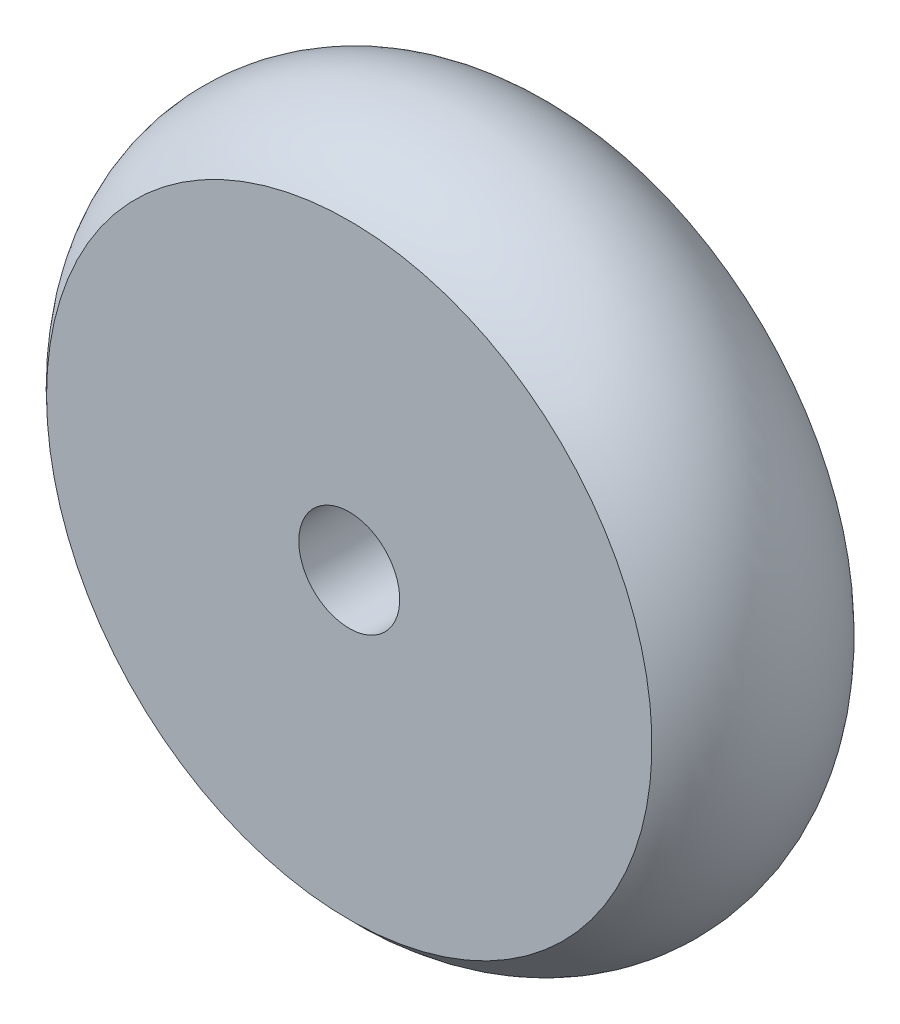
ISO-10303-21;
HEADER;
FILE_DESCRIPTION(('STEP AP214'),'2;1');
FILE_NAME('part.step','',(''),(''),'','','');
FILE_SCHEMA(('AUTOMOTIVE_DESIGN { 1 0 10303 214 1 1 1 1 }'));
ENDSEC;
DATA;
#1=APPLICATION_CONTEXT('core data for automotive mechanical design processes');
#2=APPLICATION_PROTOCOL_DEFINITION('international standard','automotive_design',2000,#1);
#3=PRODUCT_CONTEXT('',#1,'mechanical');
#4=PRODUCT('Part','Part','',(#3));
#5=PRODUCT_RELATED_PRODUCT_CATEGORY('part','',(#4));
#6=PRODUCT_DEFINITION_FORMATION('','',#4);
#7=PRODUCT_DEFINITION_CONTEXT('part definition',#1,'design');
#8=PRODUCT_DEFINITION('design','',#6,#7);
#9=PRODUCT_DEFINITION_SHAPE('','',#8);
#10=(LENGTH_UNIT() NAMED_UNIT(*) SI_UNIT(.MILLI.,.METRE.));
#11=(NAMED_UNIT(*) PLANE_ANGLE_UNIT() SI_UNIT($,.RADIAN.));
#12=(NAMED_UNIT(*) SI_UNIT($,.STERADIAN.) SOLID_ANGLE_UNIT());
#13=UNCERTAINTY_MEASURE_WITH_UNIT(LENGTH_MEASURE(1.E-05),#10,'distance_accuracy_value','');
#14=(GEOMETRIC_REPRESENTATION_CONTEXT(3) GLOBAL_UNCERTAINTY_ASSIGNED_CONTEXT((#13)) GLOBAL_UNIT_ASSIGNED_CONTEXT((#10,
#11,#12)) REPRESENTATION_CONTEXT('',''));
#15=CARTESIAN_POINT('',(0.,0.,0.));
#16=DIRECTION('',(0.,0.,1.));
#17=DIRECTION('',(1.,0.,0.));
#18=AXIS2_PLACEMENT_3D('',#15,#16,#17);
#19=CARTESIAN_POINT('',(0.,0.,1.5));
#20=DIRECTION('',(0.,0.,-1.));
#21=DIRECTION('',(-1.,0.,0.));
#22=AXIS2_PLACEMENT_3D('',#19,#20,#21);
#23=TOROIDAL_SURFACE('',#22,3.1771243444677,2.);
#24=CARTESIAN_POINT('',(0.,0.,3.));
#25=DIRECTION('',(0.,0.,-1.));
#26=DIRECTION('',(-1.,0.,0.));
#27=AXIS2_PLACEMENT_3D('',#24,#25,#26);
#28=CIRCLE('',#27,4.5);
#29=CARTESIAN_POINT('',(-4.5,0.,3.));
#30=VERTEX_POINT('',#29);
#31=EDGE_CURVE('E10',#30,#30,#28,.T.);
#32=ORIENTED_EDGE('',*,*,#31,.T.);
#33=EDGE_LOOP('',(#32));
#34=FACE_BOUND('',#33,.T.);
#35=CARTESIAN_POINT('',(0.,0.,0.));
#36=DIRECTION('',(0.,0.,-1.));
#37=DIRECTION('',(-1.,0.,0.));
#38=AXIS2_PLACEMENT_3D('',#35,#36,#37);
#39=CIRCLE('',#38,4.5);
#40=CARTESIAN_POINT('',(-4.5,0.,0.));
#41=VERTEX_POINT('',#40);
#42=EDGE_CURVE('E47',#41,#41,#39,.T.);
#43=ORIENTED_EDGE('',*,*,#42,.F.);
#44=EDGE_LOOP('',(#43));
#45=FACE_BOUND('',#44,.T.);
#46=ADVANCED_FACE('F33',(#34,#45),#23,.T.);
#47=CARTESIAN_POINT('',(-4.5,0.,3.));
#48=DIRECTION('',(0.,0.,1.));
#49=DIRECTION('',(1.,0.,0.));
#50=AXIS2_PLACEMENT_3D('',#47,#48,#49);
#51=PLANE('',#50);
#52=CARTESIAN_POINT('',(0.,0.,3.));
#53=DIRECTION('',(0.,0.,-1.));
#54=DIRECTION('',(-1.,0.,0.));
#55=AXIS2_PLACEMENT_3D('',#52,#53,#54);
#56=CIRCLE('',#55,0.75);
#57=CARTESIAN_POINT('',(-0.749999999999999,0.,3.));
#58=VERTEX_POINT('',#57);
#59=EDGE_CURVE('E39',#58,#58,#56,.T.);
#60=ORIENTED_EDGE('',*,*,#59,.T.);
#61=EDGE_LOOP('',(#60));
#62=FACE_BOUND('',#61,.T.);
#63=ORIENTED_EDGE('',*,*,#31,.F.);
#64=EDGE_LOOP('',(#63));
#65=FACE_BOUND('',#64,.T.);
#66=ADVANCED_FACE('F56',(#62,#65),#51,.T.);
#67=CARTESIAN_POINT('',(0.,0.,0.));
#68=DIRECTION('',(0.,0.,-1.));
#69=DIRECTION('',(-1.,0.,0.));
#70=AXIS2_PLACEMENT_3D('',#67,#68,#69);
#71=CYLINDRICAL_SURFACE('',#70,0.75);
#72=CARTESIAN_POINT('',(0.,0.,1.));
#73=DIRECTION('',(0.,0.,-1.));
#74=DIRECTION('',(-1.,0.,0.));
#75=AXIS2_PLACEMENT_3D('',#72,#73,#74);
#76=CIRCLE('',#75,0.75);
#77=CARTESIAN_POINT('',(-0.749999999999999,0.,1.));
#78=VERTEX_POINT('',#77);
#79=EDGE_CURVE('E43',#78,#78,#76,.T.);
#80=ORIENTED_EDGE('',*,*,#79,.T.);
#81=EDGE_LOOP('',(#80));
#82=FACE_BOUND('',#81,.T.);
#83=ORIENTED_EDGE('',*,*,#59,.F.);
#84=EDGE_LOOP('',(#83));
#85=FACE_BOUND('',#84,.T.);
#86=ADVANCED_FACE('F60',(#82,#85),#71,.F.);
#87=CARTESIAN_POINT('',(-0.749999999999999,0.,1.));
#88=DIRECTION('',(0.,0.,1.));
#89=DIRECTION('',(1.,0.,0.));
#90=AXIS2_PLACEMENT_3D('',#87,#88,#89);
#91=PLANE('',#90);
#92=ORIENTED_EDGE('',*,*,#79,.F.);
#93=EDGE_LOOP('',(#92));
#94=FACE_BOUND('',#93,.T.);
#95=ADVANCED_FACE('F64',(#94),#91,.T.);
#96=CARTESIAN_POINT('',(0.,0.,0.));
#97=DIRECTION('',(0.,0.,-1.));
#98=DIRECTION('',(-1.,0.,0.));
#99=AXIS2_PLACEMENT_3D('',#96,#97,#98);
#100=PLANE('',#99);
#101=ORIENTED_EDGE('',*,*,#42,.T.);
#102=EDGE_LOOP('',(#101));
#103=FACE_BOUND('',#102,.T.);
#104=ADVANCED_FACE('F53',(#103),#100,.T.);
#105=CLOSED_SHELL('',(#46,#66,#86,#95,#104));
#106=MANIFOLD_SOLID_BREP('B2',#105);
#107=ADVANCED_BREP_SHAPE_REPRESENTATION('',(#18,#106),#14);
#108=SHAPE_DEFINITION_REPRESENTATION(#9,#107);
ENDSEC;
END-ISO-10303-21;
